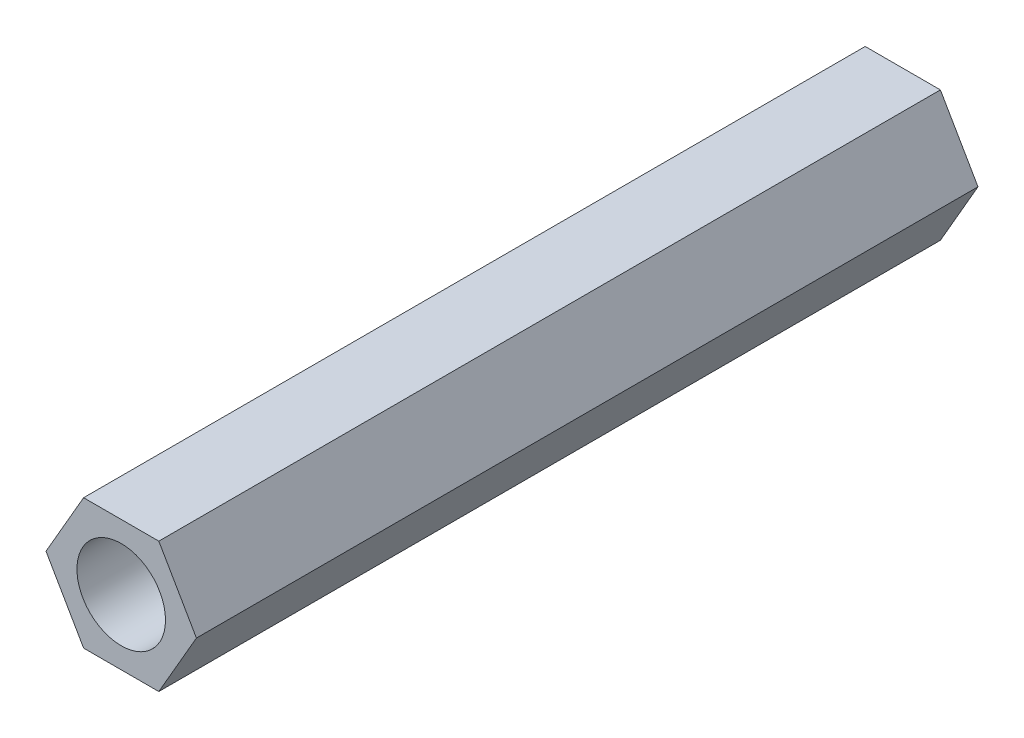
ISO-10303-21;
HEADER;
FILE_DESCRIPTION(('STEP AP214'),'2;1');
FILE_NAME('part.step','',(''),(''),'','','');
FILE_SCHEMA(('AUTOMOTIVE_DESIGN { 1 0 10303 214 1 1 1 1 }'));
ENDSEC;
DATA;
#1=APPLICATION_CONTEXT('core data for automotive mechanical design processes');
#2=APPLICATION_PROTOCOL_DEFINITION('international standard','automotive_design',2000,#1);
#3=PRODUCT_CONTEXT('',#1,'mechanical');
#4=PRODUCT('Part','Part','',(#3));
#5=PRODUCT_RELATED_PRODUCT_CATEGORY('part','',(#4));
#6=PRODUCT_DEFINITION_FORMATION('','',#4);
#7=PRODUCT_DEFINITION_CONTEXT('part definition',#1,'design');
#8=PRODUCT_DEFINITION('design','',#6,#7);
#9=PRODUCT_DEFINITION_SHAPE('','',#8);
#10=(LENGTH_UNIT() NAMED_UNIT(*) SI_UNIT(.MILLI.,.METRE.));
#11=(NAMED_UNIT(*) PLANE_ANGLE_UNIT() SI_UNIT($,.RADIAN.));
#12=(NAMED_UNIT(*) SI_UNIT($,.STERADIAN.) SOLID_ANGLE_UNIT());
#13=UNCERTAINTY_MEASURE_WITH_UNIT(LENGTH_MEASURE(1.E-05),#10,'distance_accuracy_value','');
#14=(GEOMETRIC_REPRESENTATION_CONTEXT(3) GLOBAL_UNCERTAINTY_ASSIGNED_CONTEXT((#13)) GLOBAL_UNIT_ASSIGNED_CONTEXT((#10,
#11,#12)) REPRESENTATION_CONTEXT('',''));
#15=CARTESIAN_POINT('',(0.,0.,0.));
#16=DIRECTION('',(0.,0.,1.));
#17=DIRECTION('',(1.,0.,0.));
#18=AXIS2_PLACEMENT_3D('',#15,#16,#17);
#19=CARTESIAN_POINT('',(-1.44337567297406,-2.5,30.));
#20=DIRECTION('',(0.,1.,0.));
#21=DIRECTION('',(0.,0.,1.));
#22=AXIS2_PLACEMENT_3D('',#19,#20,#21);
#23=PLANE('',#22);
#24=DIRECTION('',(1.,0.,0.));
#25=VECTOR('',#24,1.);
#26=CARTESIAN_POINT('',(-1.44337567297406,-2.5,0.));
#27=LINE('',#26,#25);
#28=CARTESIAN_POINT('',(-1.44337567297406,-2.5,0.));
#29=VERTEX_POINT('',#28);
#30=CARTESIAN_POINT('',(1.44337567297406,-2.5,0.));
#31=VERTEX_POINT('',#30);
#32=EDGE_CURVE('E117',#29,#31,#27,.T.);
#33=ORIENTED_EDGE('',*,*,#32,.T.);
#34=DIRECTION('',(0.,0.,-1.));
#35=VECTOR('',#34,1.);
#36=CARTESIAN_POINT('',(1.44337567297406,-2.5,30.));
#37=LINE('',#36,#35);
#38=CARTESIAN_POINT('',(1.44337567297406,-2.5,30.));
#39=VERTEX_POINT('',#38);
#40=EDGE_CURVE('E11',#39,#31,#37,.T.);
#41=ORIENTED_EDGE('',*,*,#40,.F.);
#42=DIRECTION('',(1.,0.,0.));
#43=VECTOR('',#42,1.);
#44=CARTESIAN_POINT('',(-1.44337567297406,-2.5,30.));
#45=LINE('',#44,#43);
#46=CARTESIAN_POINT('',(-1.44337567297406,-2.5,30.));
#47=VERTEX_POINT('',#46);
#48=EDGE_CURVE('E128',#47,#39,#45,.T.);
#49=ORIENTED_EDGE('',*,*,#48,.F.);
#50=DIRECTION('',(0.,0.,-1.));
#51=VECTOR('',#50,1.);
#52=CARTESIAN_POINT('',(-1.44337567297406,-2.5,30.));
#53=LINE('',#52,#51);
#54=EDGE_CURVE('E113',#47,#29,#53,.T.);
#55=ORIENTED_EDGE('',*,*,#54,.T.);
#56=EDGE_LOOP('',(#33,#41,#49,#55));
#57=FACE_BOUND('',#56,.T.);
#58=ADVANCED_FACE('F33',(#57),#23,.F.);
#59=CARTESIAN_POINT('',(1.44337567297406,-2.5,30.));
#60=DIRECTION('',(-0.866025403784438,0.5,0.));
#61=DIRECTION('',(-0.5,-0.866025403784439,0.));
#62=AXIS2_PLACEMENT_3D('',#59,#60,#61);
#63=PLANE('',#62);
#64=DIRECTION('',(0.5,0.866025403784438,0.));
#65=VECTOR('',#64,1.);
#66=CARTESIAN_POINT('',(1.44337567297406,-2.5,0.));
#67=LINE('',#66,#65);
#68=CARTESIAN_POINT('',(2.88675134594813,0.,0.));
#69=VERTEX_POINT('',#68);
#70=EDGE_CURVE('E120',#31,#69,#67,.T.);
#71=ORIENTED_EDGE('',*,*,#70,.T.);
#72=DIRECTION('',(0.,0.,-1.));
#73=VECTOR('',#72,1.);
#74=CARTESIAN_POINT('',(2.88675134594813,0.,30.));
#75=LINE('',#74,#73);
#76=CARTESIAN_POINT('',(2.88675134594813,0.,30.));
#77=VERTEX_POINT('',#76);
#78=EDGE_CURVE('E41',#77,#69,#75,.T.);
#79=ORIENTED_EDGE('',*,*,#78,.F.);
#80=DIRECTION('',(0.5,0.866025403784438,0.));
#81=VECTOR('',#80,1.);
#82=CARTESIAN_POINT('',(1.44337567297406,-2.5,30.));
#83=LINE('',#82,#81);
#84=EDGE_CURVE('E86',#39,#77,#83,.T.);
#85=ORIENTED_EDGE('',*,*,#84,.F.);
#86=ORIENTED_EDGE('',*,*,#40,.T.);
#87=EDGE_LOOP('',(#71,#79,#85,#86));
#88=FACE_BOUND('',#87,.T.);
#89=ADVANCED_FACE('F153',(#88),#63,.F.);
#90=CARTESIAN_POINT('',(2.88675134594813,0.,30.));
#91=DIRECTION('',(-0.866025403784438,-0.5,0.));
#92=DIRECTION('',(0.5,-0.866025403784439,0.));
#93=AXIS2_PLACEMENT_3D('',#90,#91,#92);
#94=PLANE('',#93);
#95=DIRECTION('',(-0.5,0.866025403784438,0.));
#96=VECTOR('',#95,1.);
#97=CARTESIAN_POINT('',(2.88675134594813,0.,0.));
#98=LINE('',#97,#96);
#99=CARTESIAN_POINT('',(1.44337567297406,2.5,0.));
#100=VERTEX_POINT('',#99);
#101=EDGE_CURVE('E123',#69,#100,#98,.T.);
#102=ORIENTED_EDGE('',*,*,#101,.T.);
#103=DIRECTION('',(0.,0.,-1.));
#104=VECTOR('',#103,1.);
#105=CARTESIAN_POINT('',(1.44337567297406,2.5,30.));
#106=LINE('',#105,#104);
#107=CARTESIAN_POINT('',(1.44337567297406,2.5,30.));
#108=VERTEX_POINT('',#107);
#109=EDGE_CURVE('E108',#108,#100,#106,.T.);
#110=ORIENTED_EDGE('',*,*,#109,.F.);
#111=DIRECTION('',(-0.5,0.866025403784438,0.));
#112=VECTOR('',#111,1.);
#113=CARTESIAN_POINT('',(2.88675134594813,0.,30.));
#114=LINE('',#113,#112);
#115=EDGE_CURVE('E99',#77,#108,#114,.T.);
#116=ORIENTED_EDGE('',*,*,#115,.F.);
#117=ORIENTED_EDGE('',*,*,#78,.T.);
#118=EDGE_LOOP('',(#102,#110,#116,#117));
#119=FACE_BOUND('',#118,.T.);
#120=ADVANCED_FACE('F134',(#119),#94,.F.);
#121=CARTESIAN_POINT('',(1.44337567297406,2.5,30.));
#122=DIRECTION('',(0.,-1.,0.));
#123=DIRECTION('',(1.,0.,0.));
#124=AXIS2_PLACEMENT_3D('',#121,#122,#123);
#125=PLANE('',#124);
#126=DIRECTION('',(-1.,0.,0.));
#127=VECTOR('',#126,1.);
#128=CARTESIAN_POINT('',(1.44337567297406,2.5,0.));
#129=LINE('',#128,#127);
#130=CARTESIAN_POINT('',(-1.44337567297406,2.5,0.));
#131=VERTEX_POINT('',#130);
#132=EDGE_CURVE('E107',#100,#131,#129,.T.);
#133=ORIENTED_EDGE('',*,*,#132,.T.);
#134=DIRECTION('',(0.,0.,-1.));
#135=VECTOR('',#134,1.);
#136=CARTESIAN_POINT('',(-1.44337567297406,2.5,30.));
#137=LINE('',#136,#135);
#138=CARTESIAN_POINT('',(-1.44337567297406,2.5,30.));
#139=VERTEX_POINT('',#138);
#140=EDGE_CURVE('E104',#139,#131,#137,.T.);
#141=ORIENTED_EDGE('',*,*,#140,.F.);
#142=DIRECTION('',(-1.,0.,0.));
#143=VECTOR('',#142,1.);
#144=CARTESIAN_POINT('',(1.44337567297406,2.5,30.));
#145=LINE('',#144,#143);
#146=EDGE_CURVE('E93',#108,#139,#145,.T.);
#147=ORIENTED_EDGE('',*,*,#146,.F.);
#148=ORIENTED_EDGE('',*,*,#109,.T.);
#149=EDGE_LOOP('',(#133,#141,#147,#148));
#150=FACE_BOUND('',#149,.T.);
#151=ADVANCED_FACE('F105',(#150),#125,.F.);
#152=CARTESIAN_POINT('',(-1.44337567297406,2.5,30.));
#153=DIRECTION('',(0.866025403784439,-0.5,0.));
#154=DIRECTION('',(0.5,0.866025403784439,0.));
#155=AXIS2_PLACEMENT_3D('',#152,#153,#154);
#156=PLANE('',#155);
#157=DIRECTION('',(-0.5,-0.866025403784439,0.));
#158=VECTOR('',#157,1.);
#159=CARTESIAN_POINT('',(-1.44337567297406,2.5,0.));
#160=LINE('',#159,#158);
#161=CARTESIAN_POINT('',(-2.88675134594813,0.,0.));
#162=VERTEX_POINT('',#161);
#163=EDGE_CURVE('E72',#131,#162,#160,.T.);
#164=ORIENTED_EDGE('',*,*,#163,.T.);
#165=DIRECTION('',(0.,0.,-1.));
#166=VECTOR('',#165,1.);
#167=CARTESIAN_POINT('',(-2.88675134594813,0.,30.));
#168=LINE('',#167,#166);
#169=CARTESIAN_POINT('',(-2.88675134594813,0.,30.));
#170=VERTEX_POINT('',#169);
#171=EDGE_CURVE('E109',#170,#162,#168,.T.);
#172=ORIENTED_EDGE('',*,*,#171,.F.);
#173=DIRECTION('',(-0.5,-0.866025403784439,0.));
#174=VECTOR('',#173,1.);
#175=CARTESIAN_POINT('',(-1.44337567297406,2.5,30.));
#176=LINE('',#175,#174);
#177=EDGE_CURVE('E97',#139,#170,#176,.T.);
#178=ORIENTED_EDGE('',*,*,#177,.F.);
#179=ORIENTED_EDGE('',*,*,#140,.T.);
#180=EDGE_LOOP('',(#164,#172,#178,#179));
#181=FACE_BOUND('',#180,.T.);
#182=ADVANCED_FACE('F111',(#181),#156,.F.);
#183=CARTESIAN_POINT('',(-2.88675134594813,0.,30.));
#184=DIRECTION('',(0.866025403784439,0.5,0.));
#185=DIRECTION('',(-0.5,0.866025403784439,0.));
#186=AXIS2_PLACEMENT_3D('',#183,#184,#185);
#187=PLANE('',#186);
#188=DIRECTION('',(0.5,-0.866025403784439,0.));
#189=VECTOR('',#188,1.);
#190=CARTESIAN_POINT('',(-2.88675134594813,0.,0.));
#191=LINE('',#190,#189);
#192=EDGE_CURVE('E78',#162,#29,#191,.T.);
#193=ORIENTED_EDGE('',*,*,#192,.T.);
#194=ORIENTED_EDGE('',*,*,#54,.F.);
#195=DIRECTION('',(0.5,-0.866025403784439,0.));
#196=VECTOR('',#195,1.);
#197=CARTESIAN_POINT('',(-2.88675134594813,0.,30.));
#198=LINE('',#197,#196);
#199=EDGE_CURVE('E49',#170,#47,#198,.T.);
#200=ORIENTED_EDGE('',*,*,#199,.F.);
#201=ORIENTED_EDGE('',*,*,#171,.T.);
#202=EDGE_LOOP('',(#193,#194,#200,#201));
#203=FACE_BOUND('',#202,.T.);
#204=ADVANCED_FACE('F141',(#203),#187,.F.);
#205=CARTESIAN_POINT('',(0.,0.,30.));
#206=DIRECTION('',(0.,0.,1.));
#207=DIRECTION('',(1.,0.,0.));
#208=AXIS2_PLACEMENT_3D('',#205,#206,#207);
#209=PLANE('',#208);
#210=CARTESIAN_POINT('',(0.,0.,30.));
#211=DIRECTION('',(0.,0.,1.));
#212=DIRECTION('',(1.,0.,0.));
#213=AXIS2_PLACEMENT_3D('',#210,#211,#212);
#214=CIRCLE('',#213,1.69999999999999);
#215=CARTESIAN_POINT('',(1.69999999999999,0.,30.));
#216=VERTEX_POINT('',#215);
#217=EDGE_CURVE('E208',#216,#216,#214,.T.);
#218=ORIENTED_EDGE('',*,*,#217,.F.);
#219=EDGE_LOOP('',(#218));
#220=FACE_BOUND('',#219,.T.);
#221=ORIENTED_EDGE('',*,*,#48,.T.);
#222=ORIENTED_EDGE('',*,*,#84,.T.);
#223=ORIENTED_EDGE('',*,*,#115,.T.);
#224=ORIENTED_EDGE('',*,*,#146,.T.);
#225=ORIENTED_EDGE('',*,*,#177,.T.);
#226=ORIENTED_EDGE('',*,*,#199,.T.);
#227=EDGE_LOOP('',(#221,#222,#223,#224,#225,#226));
#228=FACE_BOUND('',#227,.T.);
#229=ADVANCED_FACE('F95',(#220,#228),#209,.T.);
#230=CARTESIAN_POINT('',(0.,0.,0.));
#231=DIRECTION('',(0.,0.,1.));
#232=DIRECTION('',(1.,0.,0.));
#233=AXIS2_PLACEMENT_3D('',#230,#231,#232);
#234=PLANE('',#233);
#235=CARTESIAN_POINT('',(0.,0.,0.));
#236=DIRECTION('',(0.,0.,1.));
#237=DIRECTION('',(1.,0.,0.));
#238=AXIS2_PLACEMENT_3D('',#235,#236,#237);
#239=CIRCLE('',#238,1.7);
#240=CARTESIAN_POINT('',(1.7,0.,0.));
#241=VERTEX_POINT('',#240);
#242=EDGE_CURVE('E121',#241,#241,#239,.T.);
#243=ORIENTED_EDGE('',*,*,#242,.T.);
#244=EDGE_LOOP('',(#243));
#245=FACE_BOUND('',#244,.T.);
#246=ORIENTED_EDGE('',*,*,#32,.F.);
#247=ORIENTED_EDGE('',*,*,#192,.F.);
#248=ORIENTED_EDGE('',*,*,#163,.F.);
#249=ORIENTED_EDGE('',*,*,#132,.F.);
#250=ORIENTED_EDGE('',*,*,#101,.F.);
#251=ORIENTED_EDGE('',*,*,#70,.F.);
#252=EDGE_LOOP('',(#246,#247,#248,#249,#250,#251));
#253=FACE_BOUND('',#252,.T.);
#254=ADVANCED_FACE('F137',(#245,#253),#234,.F.);
#255=CARTESIAN_POINT('',(0.,0.,30.));
#256=DIRECTION('',(0.,0.,1.));
#257=DIRECTION('',(1.,0.,0.));
#258=AXIS2_PLACEMENT_3D('',#255,#256,#257);
#259=CYLINDRICAL_SURFACE('',#258,1.69999999999999);
#260=ORIENTED_EDGE('',*,*,#242,.F.);
#261=EDGE_LOOP('',(#260));
#262=FACE_BOUND('',#261,.T.);
#263=ORIENTED_EDGE('',*,*,#217,.T.);
#264=EDGE_LOOP('',(#263));
#265=FACE_BOUND('',#264,.T.);
#266=ADVANCED_FACE('F190',(#262,#265),#259,.F.);
#267=CLOSED_SHELL('',(#58,#89,#120,#151,#182,#204,#229,#254,#266));
#268=MANIFOLD_SOLID_BREP('B2',#267);
#269=ADVANCED_BREP_SHAPE_REPRESENTATION('',(#18,#268),#14);
#270=SHAPE_DEFINITION_REPRESENTATION(#9,#269);
ENDSEC;
END-ISO-10303-21;
